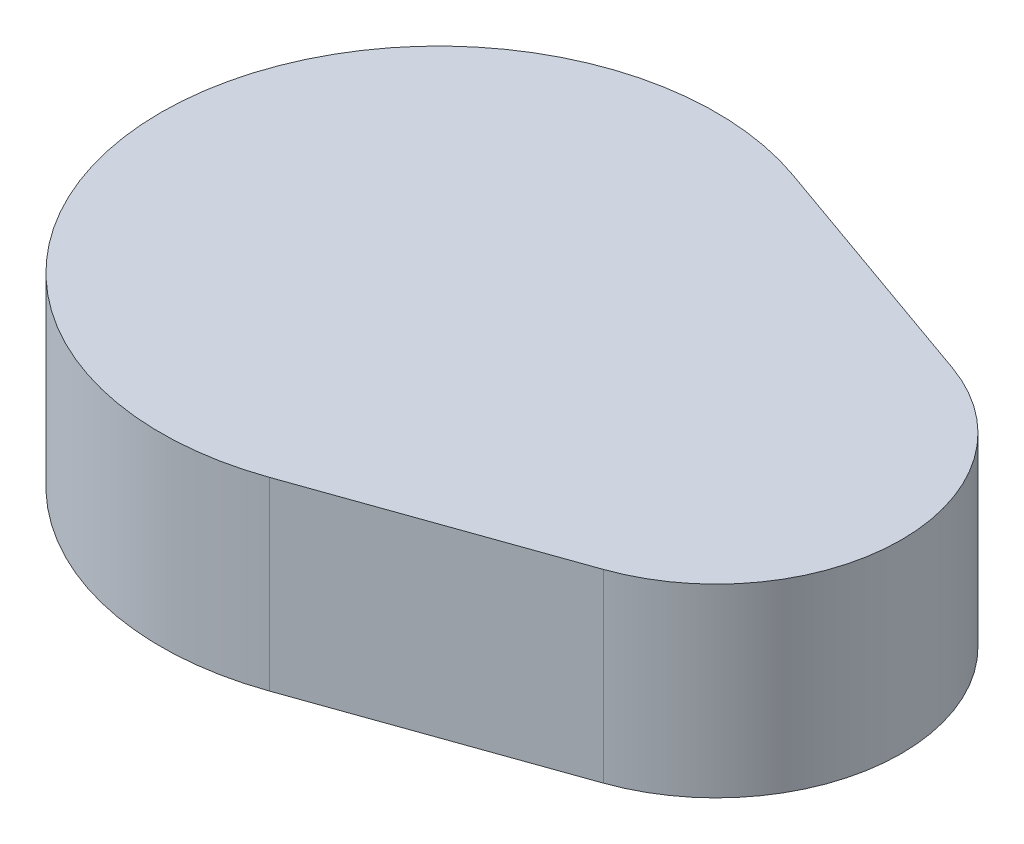
ISO-10303-21;
HEADER;
FILE_DESCRIPTION(('STEP AP214'),'2;1');
FILE_NAME('part.step','',(''),(''),'','','');
FILE_SCHEMA(('AUTOMOTIVE_DESIGN { 1 0 10303 214 1 1 1 1 }'));
ENDSEC;
DATA;
#1=APPLICATION_CONTEXT('core data for automotive mechanical design processes');
#2=APPLICATION_PROTOCOL_DEFINITION('international standard','automotive_design',2000,#1);
#3=PRODUCT_CONTEXT('',#1,'mechanical');
#4=PRODUCT('Part','Part','',(#3));
#5=PRODUCT_RELATED_PRODUCT_CATEGORY('part','',(#4));
#6=PRODUCT_DEFINITION_FORMATION('','',#4);
#7=PRODUCT_DEFINITION_CONTEXT('part definition',#1,'design');
#8=PRODUCT_DEFINITION('design','',#6,#7);
#9=PRODUCT_DEFINITION_SHAPE('','',#8);
#10=(LENGTH_UNIT() NAMED_UNIT(*) SI_UNIT(.MILLI.,.METRE.));
#11=(NAMED_UNIT(*) PLANE_ANGLE_UNIT() SI_UNIT($,.RADIAN.));
#12=(NAMED_UNIT(*) SI_UNIT($,.STERADIAN.) SOLID_ANGLE_UNIT());
#13=UNCERTAINTY_MEASURE_WITH_UNIT(LENGTH_MEASURE(1.E-05),#10,'distance_accuracy_value','');
#14=(GEOMETRIC_REPRESENTATION_CONTEXT(3) GLOBAL_UNCERTAINTY_ASSIGNED_CONTEXT((#13)) GLOBAL_UNIT_ASSIGNED_CONTEXT((#10,
#11,#12)) REPRESENTATION_CONTEXT('',''));
#15=CARTESIAN_POINT('',(0.,0.,0.));
#16=DIRECTION('',(0.,0.,1.));
#17=DIRECTION('',(1.,0.,0.));
#18=AXIS2_PLACEMENT_3D('',#15,#16,#17);
#19=CARTESIAN_POINT('',(0.,10.,0.));
#20=DIRECTION('',(0.,-1.,0.));
#21=DIRECTION('',(0.,0.,-1.));
#22=AXIS2_PLACEMENT_3D('',#19,#20,#21);
#23=CYLINDRICAL_SURFACE('',#22,15.);
#24=CARTESIAN_POINT('',(0.,0.,0.));
#25=DIRECTION('',(0.,1.,0.));
#26=DIRECTION('',(0.,0.,1.));
#27=AXIS2_PLACEMENT_3D('',#24,#25,#26);
#28=CIRCLE('',#27,15.);
#29=CARTESIAN_POINT('',(5.,0.,-14.142135623731));
#30=VERTEX_POINT('',#29);
#31=CARTESIAN_POINT('',(5.,0.,14.142135623731));
#32=VERTEX_POINT('',#31);
#33=EDGE_CURVE('E107',#30,#32,#28,.T.);
#34=ORIENTED_EDGE('',*,*,#33,.T.);
#35=DIRECTION('',(0.,-1.,0.));
#36=VECTOR('',#35,1.);
#37=CARTESIAN_POINT('',(5.,10.,14.142135623731));
#38=LINE('',#37,#36);
#39=CARTESIAN_POINT('',(5.,10.,14.142135623731));
#40=VERTEX_POINT('',#39);
#41=EDGE_CURVE('E11',#40,#32,#38,.T.);
#42=ORIENTED_EDGE('',*,*,#41,.F.);
#43=CARTESIAN_POINT('',(0.,10.,0.));
#44=DIRECTION('',(0.,1.,0.));
#45=DIRECTION('',(0.,0.,1.));
#46=AXIS2_PLACEMENT_3D('',#43,#44,#45);
#47=CIRCLE('',#46,15.);
#48=CARTESIAN_POINT('',(5.,10.,-14.142135623731));
#49=VERTEX_POINT('',#48);
#50=EDGE_CURVE('E91',#49,#40,#47,.T.);
#51=ORIENTED_EDGE('',*,*,#50,.F.);
#52=DIRECTION('',(0.,-1.,0.));
#53=VECTOR('',#52,1.);
#54=CARTESIAN_POINT('',(5.,10.,-14.142135623731));
#55=LINE('',#54,#53);
#56=EDGE_CURVE('E103',#49,#30,#55,.T.);
#57=ORIENTED_EDGE('',*,*,#56,.T.);
#58=EDGE_LOOP('',(#34,#42,#51,#57));
#59=FACE_BOUND('',#58,.T.);
#60=ADVANCED_FACE('F39',(#59),#23,.T.);
#61=CARTESIAN_POINT('',(5.,10.,14.142135623731));
#62=DIRECTION('',(-0.333333333333334,0.,-0.942809041582063));
#63=DIRECTION('',(-0.942809041582063,0.,0.333333333333334));
#64=AXIS2_PLACEMENT_3D('',#61,#62,#63);
#65=PLANE('',#64);
#66=DIRECTION('',(0.942809041582063,0.,-0.333333333333334));
#67=VECTOR('',#66,1.);
#68=CARTESIAN_POINT('',(5.,0.,14.142135623731));
#69=LINE('',#68,#67);
#70=CARTESIAN_POINT('',(18.3333333333333,0.,9.42809041582063));
#71=VERTEX_POINT('',#70);
#72=EDGE_CURVE('E96',#32,#71,#69,.T.);
#73=ORIENTED_EDGE('',*,*,#72,.T.);
#74=DIRECTION('',(0.,-1.,0.));
#75=VECTOR('',#74,1.);
#76=CARTESIAN_POINT('',(18.3333333333333,10.,9.42809041582063));
#77=LINE('',#76,#75);
#78=CARTESIAN_POINT('',(18.3333333333333,10.,9.42809041582063));
#79=VERTEX_POINT('',#78);
#80=EDGE_CURVE('E48',#79,#71,#77,.T.);
#81=ORIENTED_EDGE('',*,*,#80,.F.);
#82=DIRECTION('',(0.942809041582063,0.,-0.333333333333334));
#83=VECTOR('',#82,1.);
#84=CARTESIAN_POINT('',(5.,10.,14.142135623731));
#85=LINE('',#84,#83);
#86=EDGE_CURVE('E86',#40,#79,#85,.T.);
#87=ORIENTED_EDGE('',*,*,#86,.F.);
#88=ORIENTED_EDGE('',*,*,#41,.T.);
#89=EDGE_LOOP('',(#73,#81,#87,#88));
#90=FACE_BOUND('',#89,.T.);
#91=ADVANCED_FACE('F95',(#90),#65,.F.);
#92=CARTESIAN_POINT('',(15.,10.,0.));
#93=DIRECTION('',(0.,-1.,0.));
#94=DIRECTION('',(0.,0.,-1.));
#95=AXIS2_PLACEMENT_3D('',#92,#93,#94);
#96=CYLINDRICAL_SURFACE('',#95,10.);
#97=CARTESIAN_POINT('',(15.,0.,0.));
#98=DIRECTION('',(0.,1.,0.));
#99=DIRECTION('',(0.,0.,-1.));
#100=AXIS2_PLACEMENT_3D('',#97,#98,#99);
#101=CIRCLE('',#100,10.);
#102=CARTESIAN_POINT('',(18.3333333333333,0.,-9.42809041582063));
#103=VERTEX_POINT('',#102);
#104=EDGE_CURVE('E73',#71,#103,#101,.T.);
#105=ORIENTED_EDGE('',*,*,#104,.T.);
#106=DIRECTION('',(0.,-1.,0.));
#107=VECTOR('',#106,1.);
#108=CARTESIAN_POINT('',(18.3333333333333,10.,-9.42809041582063));
#109=LINE('',#108,#107);
#110=CARTESIAN_POINT('',(18.3333333333333,10.,-9.42809041582063));
#111=VERTEX_POINT('',#110);
#112=EDGE_CURVE('E98',#111,#103,#109,.T.);
#113=ORIENTED_EDGE('',*,*,#112,.F.);
#114=CARTESIAN_POINT('',(15.,10.,0.));
#115=DIRECTION('',(0.,1.,0.));
#116=DIRECTION('',(0.,0.,-1.));
#117=AXIS2_PLACEMENT_3D('',#114,#115,#116);
#118=CIRCLE('',#117,10.);
#119=EDGE_CURVE('E89',#79,#111,#118,.T.);
#120=ORIENTED_EDGE('',*,*,#119,.F.);
#121=ORIENTED_EDGE('',*,*,#80,.T.);
#122=EDGE_LOOP('',(#105,#113,#120,#121));
#123=FACE_BOUND('',#122,.T.);
#124=ADVANCED_FACE('F99',(#123),#96,.T.);
#125=CARTESIAN_POINT('',(5.,10.,-14.142135623731));
#126=DIRECTION('',(-0.333333333333334,0.,0.942809041582063));
#127=DIRECTION('',(0.942809041582063,0.,0.333333333333334));
#128=AXIS2_PLACEMENT_3D('',#125,#126,#127);
#129=PLANE('',#128);
#130=DIRECTION('',(-0.942809041582063,0.,-0.333333333333334));
#131=VECTOR('',#130,1.);
#132=CARTESIAN_POINT('',(5.,0.,-14.142135623731));
#133=LINE('',#132,#131);
#134=EDGE_CURVE('E79',#103,#30,#133,.T.);
#135=ORIENTED_EDGE('',*,*,#134,.T.);
#136=ORIENTED_EDGE('',*,*,#56,.F.);
#137=DIRECTION('',(-0.942809041582063,0.,-0.333333333333334));
#138=VECTOR('',#137,1.);
#139=CARTESIAN_POINT('',(5.,10.,-14.142135623731));
#140=LINE('',#139,#138);
#141=EDGE_CURVE('E56',#111,#49,#140,.T.);
#142=ORIENTED_EDGE('',*,*,#141,.F.);
#143=ORIENTED_EDGE('',*,*,#112,.T.);
#144=EDGE_LOOP('',(#135,#136,#142,#143));
#145=FACE_BOUND('',#144,.T.);
#146=ADVANCED_FACE('F120',(#145),#129,.F.);
#147=CARTESIAN_POINT('',(0.,10.,0.));
#148=DIRECTION('',(0.,1.,0.));
#149=DIRECTION('',(0.,0.,1.));
#150=AXIS2_PLACEMENT_3D('',#147,#148,#149);
#151=PLANE('',#150);
#152=ORIENTED_EDGE('',*,*,#50,.T.);
#153=ORIENTED_EDGE('',*,*,#86,.T.);
#154=ORIENTED_EDGE('',*,*,#119,.T.);
#155=ORIENTED_EDGE('',*,*,#141,.T.);
#156=EDGE_LOOP('',(#152,#153,#154,#155));
#157=FACE_BOUND('',#156,.T.);
#158=ADVANCED_FACE('F87',(#157),#151,.T.);
#159=CARTESIAN_POINT('',(0.,0.,0.));
#160=DIRECTION('',(0.,1.,0.));
#161=DIRECTION('',(0.,0.,1.));
#162=AXIS2_PLACEMENT_3D('',#159,#160,#161);
#163=PLANE('',#162);
#164=ORIENTED_EDGE('',*,*,#33,.F.);
#165=ORIENTED_EDGE('',*,*,#134,.F.);
#166=ORIENTED_EDGE('',*,*,#104,.F.);
#167=ORIENTED_EDGE('',*,*,#72,.F.);
#168=EDGE_LOOP('',(#164,#165,#166,#167));
#169=FACE_BOUND('',#168,.T.);
#170=ADVANCED_FACE('F123',(#169),#163,.F.);
#171=CLOSED_SHELL('',(#60,#91,#124,#146,#158,#170));
#172=MANIFOLD_SOLID_BREP('B2',#171);
#173=ADVANCED_BREP_SHAPE_REPRESENTATION('',(#18,#172),#14);
#174=SHAPE_DEFINITION_REPRESENTATION(#9,#173);
ENDSEC;
END-ISO-10303-21;
